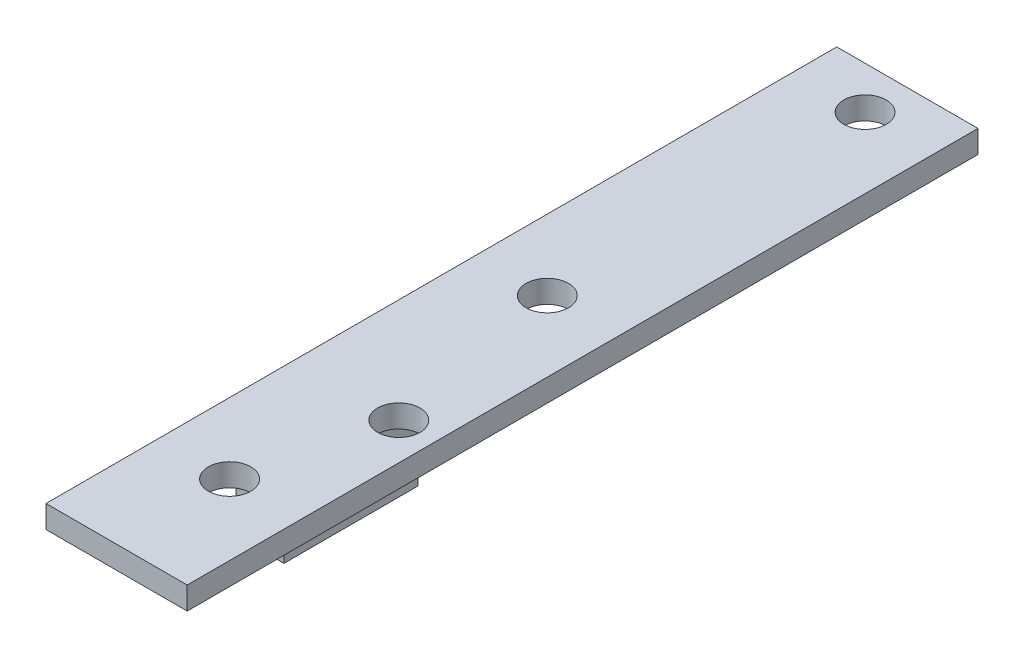
ISO-10303-21;
HEADER;
FILE_DESCRIPTION(('STEP AP214'),'2;1');
FILE_NAME('part.step','',(''),(''),'','','');
FILE_SCHEMA(('AUTOMOTIVE_DESIGN { 1 0 10303 214 1 1 1 1 }'));
ENDSEC;
DATA;
#1=APPLICATION_CONTEXT('core data for automotive mechanical design processes');
#2=APPLICATION_PROTOCOL_DEFINITION('international standard','automotive_design',2000,#1);
#3=PRODUCT_CONTEXT('',#1,'mechanical');
#4=PRODUCT('Part','Part','',(#3));
#5=PRODUCT_RELATED_PRODUCT_CATEGORY('part','',(#4));
#6=PRODUCT_DEFINITION_FORMATION('','',#4);
#7=PRODUCT_DEFINITION_CONTEXT('part definition',#1,'design');
#8=PRODUCT_DEFINITION('design','',#6,#7);
#9=PRODUCT_DEFINITION_SHAPE('','',#8);
#10=(LENGTH_UNIT() NAMED_UNIT(*) SI_UNIT(.MILLI.,.METRE.));
#11=(NAMED_UNIT(*) PLANE_ANGLE_UNIT() SI_UNIT($,.RADIAN.));
#12=(NAMED_UNIT(*) SI_UNIT($,.STERADIAN.) SOLID_ANGLE_UNIT());
#13=UNCERTAINTY_MEASURE_WITH_UNIT(LENGTH_MEASURE(1.E-05),#10,'distance_accuracy_value','');
#14=(GEOMETRIC_REPRESENTATION_CONTEXT(3) GLOBAL_UNCERTAINTY_ASSIGNED_CONTEXT((#13)) GLOBAL_UNIT_ASSIGNED_CONTEXT((#10,
#11,#12)) REPRESENTATION_CONTEXT('',''));
#15=CARTESIAN_POINT('',(0.,0.,0.));
#16=DIRECTION('',(0.,0.,1.));
#17=DIRECTION('',(1.,0.,0.));
#18=AXIS2_PLACEMENT_3D('',#15,#16,#17);
#19=CARTESIAN_POINT('',(0.,0.,0.));
#20=DIRECTION('',(0.,1.,0.));
#21=DIRECTION('',(0.,0.,1.));
#22=AXIS2_PLACEMENT_3D('',#19,#20,#21);
#23=PLANE('',#22);
#24=CARTESIAN_POINT('',(0.,0.,20.));
#25=DIRECTION('',(0.,1.,0.));
#26=DIRECTION('',(0.,0.,1.));
#27=AXIS2_PLACEMENT_3D('',#24,#25,#26);
#28=CIRCLE('',#27,1.5);
#29=CARTESIAN_POINT('',(0.,0.,21.5));
#30=VERTEX_POINT('',#29);
#31=EDGE_CURVE('E135',#30,#30,#28,.T.);
#32=ORIENTED_EDGE('',*,*,#31,.T.);
#33=EDGE_LOOP('',(#32));
#34=FACE_BOUND('',#33,.T.);
#35=CARTESIAN_POINT('',(0.,0.,-2.5));
#36=DIRECTION('',(0.,1.,0.));
#37=DIRECTION('',(0.,0.,1.));
#38=AXIS2_PLACEMENT_3D('',#35,#36,#37);
#39=CIRCLE('',#38,1.5);
#40=CARTESIAN_POINT('',(0.,0.,-1.));
#41=VERTEX_POINT('',#40);
#42=EDGE_CURVE('E148',#41,#41,#39,.T.);
#43=ORIENTED_EDGE('',*,*,#42,.T.);
#44=EDGE_LOOP('',(#43));
#45=FACE_BOUND('',#44,.T.);
#46=CARTESIAN_POINT('',(0.,0.,-25.));
#47=DIRECTION('',(0.,1.,0.));
#48=DIRECTION('',(0.,0.,1.));
#49=AXIS2_PLACEMENT_3D('',#46,#47,#48);
#50=CIRCLE('',#49,1.5);
#51=CARTESIAN_POINT('',(0.,0.,-23.5));
#52=VERTEX_POINT('',#51);
#53=EDGE_CURVE('E154',#52,#52,#50,.T.);
#54=ORIENTED_EDGE('',*,*,#53,.T.);
#55=EDGE_LOOP('',(#54));
#56=FACE_BOUND('',#55,.T.);
#57=CARTESIAN_POINT('',(2.385,0.,10.4));
#58=DIRECTION('',(0.,1.,0.));
#59=DIRECTION('',(0.,0.,1.));
#60=AXIS2_PLACEMENT_3D('',#57,#58,#59);
#61=CIRCLE('',#60,1.5);
#62=CARTESIAN_POINT('',(2.385,0.,11.9));
#63=VERTEX_POINT('',#62);
#64=EDGE_CURVE('E162',#63,#63,#61,.T.);
#65=ORIENTED_EDGE('',*,*,#64,.T.);
#66=EDGE_LOOP('',(#65));
#67=FACE_BOUND('',#66,.T.);
#68=DIRECTION('',(0.,0.,-1.));
#69=VECTOR('',#68,1.);
#70=CARTESIAN_POINT('',(5.,0.,-28.));
#71=LINE('',#70,#69);
#72=CARTESIAN_POINT('',(5.,0.,28.));
#73=VERTEX_POINT('',#72);
#74=CARTESIAN_POINT('',(5.,0.,-28.));
#75=VERTEX_POINT('',#74);
#76=EDGE_CURVE('E170',#73,#75,#71,.T.);
#77=ORIENTED_EDGE('',*,*,#76,.F.);
#78=DIRECTION('',(1.,0.,0.));
#79=VECTOR('',#78,1.);
#80=CARTESIAN_POINT('',(-5.,0.,28.));
#81=LINE('',#80,#79);
#82=CARTESIAN_POINT('',(-5.,0.,28.));
#83=VERTEX_POINT('',#82);
#84=EDGE_CURVE('E179',#83,#73,#81,.T.);
#85=ORIENTED_EDGE('',*,*,#84,.F.);
#86=DIRECTION('',(0.,0.,1.));
#87=VECTOR('',#86,1.);
#88=CARTESIAN_POINT('',(-5.,0.,-28.));
#89=LINE('',#88,#87);
#90=CARTESIAN_POINT('',(-5.,0.,-28.));
#91=VERTEX_POINT('',#90);
#92=EDGE_CURVE('E195',#91,#83,#89,.T.);
#93=ORIENTED_EDGE('',*,*,#92,.F.);
#94=DIRECTION('',(-1.,0.,0.));
#95=VECTOR('',#94,1.);
#96=CARTESIAN_POINT('',(-5.,0.,-28.));
#97=LINE('',#96,#95);
#98=EDGE_CURVE('E192',#75,#91,#97,.T.);
#99=ORIENTED_EDGE('',*,*,#98,.F.);
#100=EDGE_LOOP('',(#77,#85,#93,#99));
#101=FACE_BOUND('',#100,.T.);
#102=DIRECTION('',(0.,0.,-1.));
#103=VECTOR('',#102,1.);
#104=CARTESIAN_POINT('',(-4.4,0.,5.64999999999999));
#105=LINE('',#104,#103);
#106=CARTESIAN_POINT('',(-4.4,0.,15.15));
#107=VERTEX_POINT('',#106);
#108=CARTESIAN_POINT('',(-4.4,0.,5.64999999999999));
#109=VERTEX_POINT('',#108);
#110=EDGE_CURVE('E133',#107,#109,#105,.T.);
#111=ORIENTED_EDGE('',*,*,#110,.F.);
#112=DIRECTION('',(-1.,0.,0.));
#113=VECTOR('',#112,1.);
#114=CARTESIAN_POINT('',(-1.,0.,15.15));
#115=LINE('',#114,#113);
#116=CARTESIAN_POINT('',(-1.,0.,15.15));
#117=VERTEX_POINT('',#116);
#118=EDGE_CURVE('E130',#117,#107,#115,.T.);
#119=ORIENTED_EDGE('',*,*,#118,.F.);
#120=DIRECTION('',(0.,0.,1.));
#121=VECTOR('',#120,1.);
#122=CARTESIAN_POINT('',(-1.,0.,5.64999999999999));
#123=LINE('',#122,#121);
#124=CARTESIAN_POINT('',(-1.,0.,5.64999999999999));
#125=VERTEX_POINT('',#124);
#126=EDGE_CURVE('E66',#125,#117,#123,.T.);
#127=ORIENTED_EDGE('',*,*,#126,.F.);
#128=DIRECTION('',(1.,0.,0.));
#129=VECTOR('',#128,1.);
#130=CARTESIAN_POINT('',(-1.,0.,5.64999999999999));
#131=LINE('',#130,#129);
#132=EDGE_CURVE('E61',#109,#125,#131,.T.);
#133=ORIENTED_EDGE('',*,*,#132,.F.);
#134=EDGE_LOOP('',(#111,#119,#127,#133));
#135=FACE_BOUND('',#134,.T.);
#136=ADVANCED_FACE('F45',(#34,#45,#56,#67,#101,#135),#23,.F.);
#137=CARTESIAN_POINT('',(0.,1.6,0.));
#138=DIRECTION('',(0.,1.,0.));
#139=DIRECTION('',(0.,0.,1.));
#140=AXIS2_PLACEMENT_3D('',#137,#138,#139);
#141=PLANE('',#140);
#142=CARTESIAN_POINT('',(0.,1.6,-2.5));
#143=DIRECTION('',(0.,1.,0.));
#144=DIRECTION('',(0.,0.,1.));
#145=AXIS2_PLACEMENT_3D('',#142,#143,#144);
#146=CIRCLE('',#145,1.5);
#147=CARTESIAN_POINT('',(0.,1.6,-1.));
#148=VERTEX_POINT('',#147);
#149=EDGE_CURVE('E150',#148,#148,#146,.T.);
#150=ORIENTED_EDGE('',*,*,#149,.F.);
#151=EDGE_LOOP('',(#150));
#152=FACE_BOUND('',#151,.T.);
#153=CARTESIAN_POINT('',(2.385,1.6,10.4));
#154=DIRECTION('',(0.,1.,0.));
#155=DIRECTION('',(0.,0.,1.));
#156=AXIS2_PLACEMENT_3D('',#153,#154,#155);
#157=CIRCLE('',#156,1.5);
#158=CARTESIAN_POINT('',(2.385,1.6,11.9));
#159=VERTEX_POINT('',#158);
#160=EDGE_CURVE('E166',#159,#159,#157,.T.);
#161=ORIENTED_EDGE('',*,*,#160,.F.);
#162=EDGE_LOOP('',(#161));
#163=FACE_BOUND('',#162,.T.);
#164=DIRECTION('',(0.,0.,-1.));
#165=VECTOR('',#164,1.);
#166=CARTESIAN_POINT('',(5.,1.6,-28.));
#167=LINE('',#166,#165);
#168=CARTESIAN_POINT('',(5.,1.6,28.));
#169=VERTEX_POINT('',#168);
#170=CARTESIAN_POINT('',(5.,1.6,-28.));
#171=VERTEX_POINT('',#170);
#172=EDGE_CURVE('E174',#169,#171,#167,.T.);
#173=ORIENTED_EDGE('',*,*,#172,.T.);
#174=DIRECTION('',(-1.,0.,0.));
#175=VECTOR('',#174,1.);
#176=CARTESIAN_POINT('',(-5.,1.6,-28.));
#177=LINE('',#176,#175);
#178=CARTESIAN_POINT('',(-5.,1.6,-28.));
#179=VERTEX_POINT('',#178);
#180=EDGE_CURVE('E178',#171,#179,#177,.T.);
#181=ORIENTED_EDGE('',*,*,#180,.T.);
#182=DIRECTION('',(0.,0.,1.));
#183=VECTOR('',#182,1.);
#184=CARTESIAN_POINT('',(-5.,1.6,-28.));
#185=LINE('',#184,#183);
#186=CARTESIAN_POINT('',(-5.,1.6,28.));
#187=VERTEX_POINT('',#186);
#188=EDGE_CURVE('E182',#179,#187,#185,.T.);
#189=ORIENTED_EDGE('',*,*,#188,.T.);
#190=DIRECTION('',(1.,0.,0.));
#191=VECTOR('',#190,1.);
#192=CARTESIAN_POINT('',(-5.,1.6,28.));
#193=LINE('',#192,#191);
#194=EDGE_CURVE('E185',#187,#169,#193,.T.);
#195=ORIENTED_EDGE('',*,*,#194,.T.);
#196=EDGE_LOOP('',(#173,#181,#189,#195));
#197=FACE_BOUND('',#196,.T.);
#198=CARTESIAN_POINT('',(0.,1.6,-25.));
#199=DIRECTION('',(0.,1.,0.));
#200=DIRECTION('',(0.,0.,1.));
#201=AXIS2_PLACEMENT_3D('',#198,#199,#200);
#202=CIRCLE('',#201,1.5);
#203=CARTESIAN_POINT('',(0.,1.6,-23.5));
#204=VERTEX_POINT('',#203);
#205=EDGE_CURVE('E158',#204,#204,#202,.T.);
#206=ORIENTED_EDGE('',*,*,#205,.F.);
#207=EDGE_LOOP('',(#206));
#208=FACE_BOUND('',#207,.T.);
#209=CARTESIAN_POINT('',(0.,1.6,20.));
#210=DIRECTION('',(0.,1.,0.));
#211=DIRECTION('',(0.,0.,1.));
#212=AXIS2_PLACEMENT_3D('',#209,#210,#211);
#213=CIRCLE('',#212,1.5);
#214=CARTESIAN_POINT('',(0.,1.6,21.5));
#215=VERTEX_POINT('',#214);
#216=EDGE_CURVE('E140',#215,#215,#213,.T.);
#217=ORIENTED_EDGE('',*,*,#216,.F.);
#218=EDGE_LOOP('',(#217));
#219=FACE_BOUND('',#218,.T.);
#220=ADVANCED_FACE('F226',(#152,#163,#197,#208,#219),#141,.T.);
#221=CARTESIAN_POINT('',(5.,1.6,-28.));
#222=DIRECTION('',(-1.,0.,0.));
#223=DIRECTION('',(0.,0.,1.));
#224=AXIS2_PLACEMENT_3D('',#221,#222,#223);
#225=PLANE('',#224);
#226=ORIENTED_EDGE('',*,*,#76,.T.);
#227=DIRECTION('',(0.,-1.,0.));
#228=VECTOR('',#227,1.);
#229=CARTESIAN_POINT('',(5.,1.6,-28.));
#230=LINE('',#229,#228);
#231=EDGE_CURVE('E11',#171,#75,#230,.T.);
#232=ORIENTED_EDGE('',*,*,#231,.F.);
#233=ORIENTED_EDGE('',*,*,#172,.F.);
#234=DIRECTION('',(0.,-1.,0.));
#235=VECTOR('',#234,1.);
#236=CARTESIAN_POINT('',(5.,1.6,28.));
#237=LINE('',#236,#235);
#238=EDGE_CURVE('E188',#169,#73,#237,.T.);
#239=ORIENTED_EDGE('',*,*,#238,.T.);
#240=EDGE_LOOP('',(#226,#232,#233,#239));
#241=FACE_BOUND('',#240,.T.);
#242=ADVANCED_FACE('F47',(#241),#225,.F.);
#243=CARTESIAN_POINT('',(-5.,1.6,-28.));
#244=DIRECTION('',(0.,0.,1.));
#245=DIRECTION('',(1.,0.,0.));
#246=AXIS2_PLACEMENT_3D('',#243,#244,#245);
#247=PLANE('',#246);
#248=ORIENTED_EDGE('',*,*,#98,.T.);
#249=DIRECTION('',(0.,-1.,0.));
#250=VECTOR('',#249,1.);
#251=CARTESIAN_POINT('',(-5.,1.6,-28.));
#252=LINE('',#251,#250);
#253=EDGE_CURVE('E54',#179,#91,#252,.T.);
#254=ORIENTED_EDGE('',*,*,#253,.F.);
#255=ORIENTED_EDGE('',*,*,#180,.F.);
#256=ORIENTED_EDGE('',*,*,#231,.T.);
#257=EDGE_LOOP('',(#248,#254,#255,#256));
#258=FACE_BOUND('',#257,.T.);
#259=ADVANCED_FACE('F228',(#258),#247,.F.);
#260=CARTESIAN_POINT('',(-5.,1.6,-28.));
#261=DIRECTION('',(1.,0.,0.));
#262=DIRECTION('',(0.,0.,-1.));
#263=AXIS2_PLACEMENT_3D('',#260,#261,#262);
#264=PLANE('',#263);
#265=ORIENTED_EDGE('',*,*,#92,.T.);
#266=DIRECTION('',(0.,-1.,0.));
#267=VECTOR('',#266,1.);
#268=CARTESIAN_POINT('',(-5.,1.6,28.));
#269=LINE('',#268,#267);
#270=EDGE_CURVE('E203',#187,#83,#269,.T.);
#271=ORIENTED_EDGE('',*,*,#270,.F.);
#272=ORIENTED_EDGE('',*,*,#188,.F.);
#273=ORIENTED_EDGE('',*,*,#253,.T.);
#274=EDGE_LOOP('',(#265,#271,#272,#273));
#275=FACE_BOUND('',#274,.T.);
#276=ADVANCED_FACE('F212',(#275),#264,.F.);
#277=CARTESIAN_POINT('',(-5.,1.6,28.));
#278=DIRECTION('',(0.,0.,-1.));
#279=DIRECTION('',(-1.,0.,0.));
#280=AXIS2_PLACEMENT_3D('',#277,#278,#279);
#281=PLANE('',#280);
#282=ORIENTED_EDGE('',*,*,#84,.T.);
#283=ORIENTED_EDGE('',*,*,#238,.F.);
#284=ORIENTED_EDGE('',*,*,#194,.F.);
#285=ORIENTED_EDGE('',*,*,#270,.T.);
#286=EDGE_LOOP('',(#282,#283,#284,#285));
#287=FACE_BOUND('',#286,.T.);
#288=ADVANCED_FACE('F220',(#287),#281,.F.);
#289=CARTESIAN_POINT('',(2.385,1.6,10.4));
#290=DIRECTION('',(0.,-1.,0.));
#291=DIRECTION('',(0.,0.,-1.));
#292=AXIS2_PLACEMENT_3D('',#289,#290,#291);
#293=CYLINDRICAL_SURFACE('',#292,1.5);
#294=ORIENTED_EDGE('',*,*,#160,.T.);
#295=EDGE_LOOP('',(#294));
#296=FACE_BOUND('',#295,.T.);
#297=ORIENTED_EDGE('',*,*,#64,.F.);
#298=EDGE_LOOP('',(#297));
#299=FACE_BOUND('',#298,.T.);
#300=ADVANCED_FACE('F249',(#296,#299),#293,.F.);
#301=CARTESIAN_POINT('',(0.,1.6,-25.));
#302=DIRECTION('',(0.,-1.,0.));
#303=DIRECTION('',(0.,0.,-1.));
#304=AXIS2_PLACEMENT_3D('',#301,#302,#303);
#305=CYLINDRICAL_SURFACE('',#304,1.5);
#306=ORIENTED_EDGE('',*,*,#205,.T.);
#307=EDGE_LOOP('',(#306));
#308=FACE_BOUND('',#307,.T.);
#309=ORIENTED_EDGE('',*,*,#53,.F.);
#310=EDGE_LOOP('',(#309));
#311=FACE_BOUND('',#310,.T.);
#312=ADVANCED_FACE('F253',(#308,#311),#305,.F.);
#313=CARTESIAN_POINT('',(0.,1.6,-2.5));
#314=DIRECTION('',(0.,-1.,0.));
#315=DIRECTION('',(0.,0.,-1.));
#316=AXIS2_PLACEMENT_3D('',#313,#314,#315);
#317=CYLINDRICAL_SURFACE('',#316,1.5);
#318=ORIENTED_EDGE('',*,*,#149,.T.);
#319=EDGE_LOOP('',(#318));
#320=FACE_BOUND('',#319,.T.);
#321=ORIENTED_EDGE('',*,*,#42,.F.);
#322=EDGE_LOOP('',(#321));
#323=FACE_BOUND('',#322,.T.);
#324=ADVANCED_FACE('F258',(#320,#323),#317,.F.);
#325=CARTESIAN_POINT('',(0.,1.6,20.));
#326=DIRECTION('',(0.,-1.,0.));
#327=DIRECTION('',(0.,0.,-1.));
#328=AXIS2_PLACEMENT_3D('',#325,#326,#327);
#329=CYLINDRICAL_SURFACE('',#328,1.5);
#330=ORIENTED_EDGE('',*,*,#216,.T.);
#331=EDGE_LOOP('',(#330));
#332=FACE_BOUND('',#331,.T.);
#333=ORIENTED_EDGE('',*,*,#31,.F.);
#334=EDGE_LOOP('',(#333));
#335=FACE_BOUND('',#334,.T.);
#336=ADVANCED_FACE('F265',(#332,#335),#329,.F.);
#337=CARTESIAN_POINT('',(-4.4,-6.5,5.64999999999999));
#338=DIRECTION('',(1.,0.,0.));
#339=DIRECTION('',(0.,0.,-1.));
#340=AXIS2_PLACEMENT_3D('',#337,#338,#339);
#341=PLANE('',#340);
#342=ORIENTED_EDGE('',*,*,#110,.T.);
#343=DIRECTION('',(0.,1.,0.));
#344=VECTOR('',#343,1.);
#345=CARTESIAN_POINT('',(-4.4,-6.5,5.64999999999999));
#346=LINE('',#345,#344);
#347=CARTESIAN_POINT('',(-4.4,-6.5,5.64999999999999));
#348=VERTEX_POINT('',#347);
#349=EDGE_CURVE('E112',#348,#109,#346,.T.);
#350=ORIENTED_EDGE('',*,*,#349,.F.);
#351=DIRECTION('',(0.,0.,-1.));
#352=VECTOR('',#351,1.);
#353=CARTESIAN_POINT('',(-4.4,-6.5,5.64999999999999));
#354=LINE('',#353,#352);
#355=CARTESIAN_POINT('',(-4.4,-6.5,15.15));
#356=VERTEX_POINT('',#355);
#357=EDGE_CURVE('E120',#356,#348,#354,.T.);
#358=ORIENTED_EDGE('',*,*,#357,.F.);
#359=DIRECTION('',(0.,1.,0.));
#360=VECTOR('',#359,1.);
#361=CARTESIAN_POINT('',(-4.4,-6.5,15.15));
#362=LINE('',#361,#360);
#363=EDGE_CURVE('E365',#356,#107,#362,.T.);
#364=ORIENTED_EDGE('',*,*,#363,.T.);
#365=EDGE_LOOP('',(#342,#350,#358,#364));
#366=FACE_BOUND('',#365,.T.);
#367=ADVANCED_FACE('F132',(#366),#341,.F.);
#368=CARTESIAN_POINT('',(-1.,-6.5,5.64999999999999));
#369=DIRECTION('',(0.,0.,1.));
#370=DIRECTION('',(1.,0.,0.));
#371=AXIS2_PLACEMENT_3D('',#368,#369,#370);
#372=PLANE('',#371);
#373=ORIENTED_EDGE('',*,*,#132,.T.);
#374=DIRECTION('',(0.,1.,0.));
#375=VECTOR('',#374,1.);
#376=CARTESIAN_POINT('',(-1.,-6.5,5.64999999999999));
#377=LINE('',#376,#375);
#378=CARTESIAN_POINT('',(-1.,-6.5,5.64999999999999));
#379=VERTEX_POINT('',#378);
#380=EDGE_CURVE('E115',#379,#125,#377,.T.);
#381=ORIENTED_EDGE('',*,*,#380,.F.);
#382=DIRECTION('',(1.,0.,0.));
#383=VECTOR('',#382,1.);
#384=CARTESIAN_POINT('',(-1.,-6.5,5.64999999999999));
#385=LINE('',#384,#383);
#386=EDGE_CURVE('E108',#348,#379,#385,.T.);
#387=ORIENTED_EDGE('',*,*,#386,.F.);
#388=ORIENTED_EDGE('',*,*,#349,.T.);
#389=EDGE_LOOP('',(#373,#381,#387,#388));
#390=FACE_BOUND('',#389,.T.);
#391=ADVANCED_FACE('F110',(#390),#372,.F.);
#392=CARTESIAN_POINT('',(-1.,-6.5,5.64999999999999));
#393=DIRECTION('',(-1.,0.,0.));
#394=DIRECTION('',(0.,0.,1.));
#395=AXIS2_PLACEMENT_3D('',#392,#393,#394);
#396=PLANE('',#395);
#397=ORIENTED_EDGE('',*,*,#126,.T.);
#398=DIRECTION('',(0.,1.,0.));
#399=VECTOR('',#398,1.);
#400=CARTESIAN_POINT('',(-1.,-6.5,15.15));
#401=LINE('',#400,#399);
#402=CARTESIAN_POINT('',(-1.,-6.5,15.15));
#403=VERTEX_POINT('',#402);
#404=EDGE_CURVE('E142',#403,#117,#401,.T.);
#405=ORIENTED_EDGE('',*,*,#404,.F.);
#406=DIRECTION('',(0.,0.,1.));
#407=VECTOR('',#406,1.);
#408=CARTESIAN_POINT('',(-1.,-6.5,5.64999999999999));
#409=LINE('',#408,#407);
#410=EDGE_CURVE('E119',#379,#403,#409,.T.);
#411=ORIENTED_EDGE('',*,*,#410,.F.);
#412=ORIENTED_EDGE('',*,*,#380,.T.);
#413=EDGE_LOOP('',(#397,#405,#411,#412));
#414=FACE_BOUND('',#413,.T.);
#415=ADVANCED_FACE('F272',(#414),#396,.F.);
#416=CARTESIAN_POINT('',(-1.,-6.5,15.15));
#417=DIRECTION('',(0.,0.,-1.));
#418=DIRECTION('',(-1.,0.,0.));
#419=AXIS2_PLACEMENT_3D('',#416,#417,#418);
#420=PLANE('',#419);
#421=ORIENTED_EDGE('',*,*,#118,.T.);
#422=ORIENTED_EDGE('',*,*,#363,.F.);
#423=DIRECTION('',(-1.,0.,0.));
#424=VECTOR('',#423,1.);
#425=CARTESIAN_POINT('',(-1.,-6.5,15.15));
#426=LINE('',#425,#424);
#427=EDGE_CURVE('E125',#403,#356,#426,.T.);
#428=ORIENTED_EDGE('',*,*,#427,.F.);
#429=ORIENTED_EDGE('',*,*,#404,.T.);
#430=EDGE_LOOP('',(#421,#422,#428,#429));
#431=FACE_BOUND('',#430,.T.);
#432=ADVANCED_FACE('F275',(#431),#420,.F.);
#433=CARTESIAN_POINT('',(0.,-6.5,0.));
#434=DIRECTION('',(0.,-1.,0.));
#435=DIRECTION('',(0.,0.,-1.));
#436=AXIS2_PLACEMENT_3D('',#433,#434,#435);
#437=PLANE('',#436);
#438=ORIENTED_EDGE('',*,*,#357,.T.);
#439=ORIENTED_EDGE('',*,*,#386,.T.);
#440=ORIENTED_EDGE('',*,*,#410,.T.);
#441=ORIENTED_EDGE('',*,*,#427,.T.);
#442=EDGE_LOOP('',(#438,#439,#440,#441));
#443=FACE_BOUND('',#442,.T.);
#444=ADVANCED_FACE('F123',(#443),#437,.T.);
#445=CLOSED_SHELL('',(#136,#220,#242,#259,#276,#288,#300,#312,#324,#336,#367,#391,#415,#432,#444));
#446=MANIFOLD_SOLID_BREP('B2',#445);
#447=ADVANCED_BREP_SHAPE_REPRESENTATION('',(#18,#446),#14);
#448=SHAPE_DEFINITION_REPRESENTATION(#9,#447);
ENDSEC;
END-ISO-10303-21;
